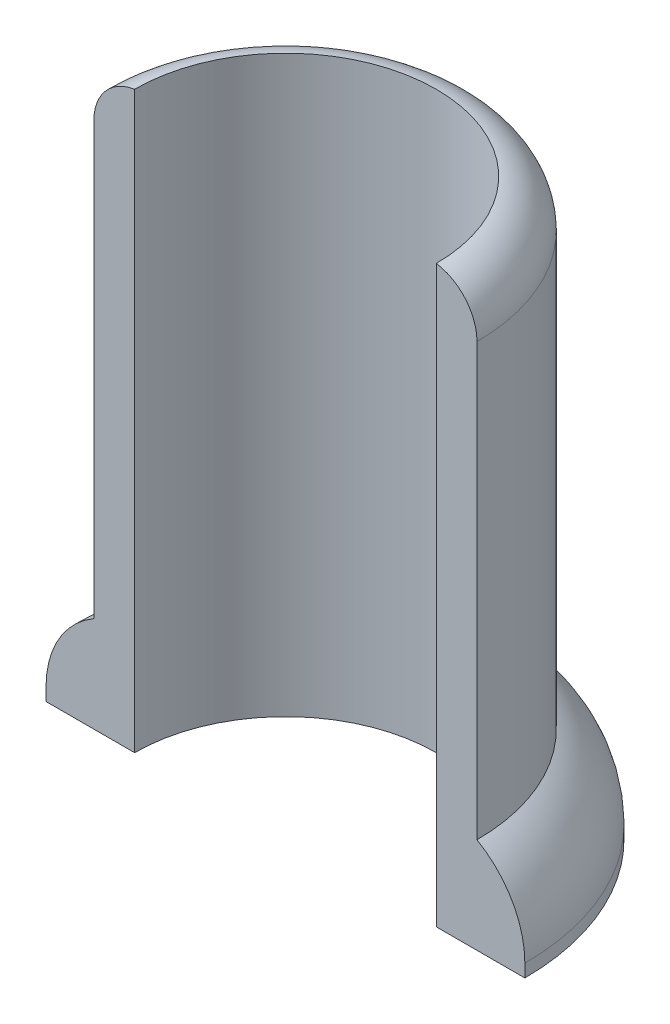
ISO-10303-21;
HEADER;
FILE_DESCRIPTION(('STEP AP214'),'2;1');
FILE_NAME('part.step','',(''),(''),'','','');
FILE_SCHEMA(('AUTOMOTIVE_DESIGN { 1 0 10303 214 1 1 1 1 }'));
ENDSEC;
DATA;
#1=APPLICATION_CONTEXT('core data for automotive mechanical design processes');
#2=APPLICATION_PROTOCOL_DEFINITION('international standard','automotive_design',2000,#1);
#3=PRODUCT_CONTEXT('',#1,'mechanical');
#4=PRODUCT('Part','Part','',(#3));
#5=PRODUCT_RELATED_PRODUCT_CATEGORY('part','',(#4));
#6=PRODUCT_DEFINITION_FORMATION('','',#4);
#7=PRODUCT_DEFINITION_CONTEXT('part definition',#1,'design');
#8=PRODUCT_DEFINITION('design','',#6,#7);
#9=PRODUCT_DEFINITION_SHAPE('','',#8);
#10=(LENGTH_UNIT() NAMED_UNIT(*) SI_UNIT(.MILLI.,.METRE.));
#11=(NAMED_UNIT(*) PLANE_ANGLE_UNIT() SI_UNIT($,.RADIAN.));
#12=(NAMED_UNIT(*) SI_UNIT($,.STERADIAN.) SOLID_ANGLE_UNIT());
#13=UNCERTAINTY_MEASURE_WITH_UNIT(LENGTH_MEASURE(1.E-05),#10,'distance_accuracy_value','');
#14=(GEOMETRIC_REPRESENTATION_CONTEXT(3) GLOBAL_UNCERTAINTY_ASSIGNED_CONTEXT((#13)) GLOBAL_UNIT_ASSIGNED_CONTEXT((#10,
#11,#12)) REPRESENTATION_CONTEXT('',''));
#15=CARTESIAN_POINT('',(0.,0.,0.));
#16=DIRECTION('',(0.,0.,1.));
#17=DIRECTION('',(1.,0.,0.));
#18=AXIS2_PLACEMENT_3D('',#15,#16,#17);
#19=CARTESIAN_POINT('',(5.,10.01,0.));
#20=DIRECTION('',(0.,0.,1.));
#21=DIRECTION('',(1.,0.,0.));
#22=AXIS2_PLACEMENT_3D('',#19,#20,#21);
#23=PLANE('',#22);
#24=CARTESIAN_POINT('',(3.,-1.73205080756888,0.));
#25=DIRECTION('',(0.,0.,1.));
#26=DIRECTION('',(1.,0.,0.));
#27=AXIS2_PLACEMENT_3D('',#24,#25,#26);
#28=CIRCLE('',#27,2.);
#29=CARTESIAN_POINT('',(4.,0.,0.));
#30=VERTEX_POINT('',#29);
#31=CARTESIAN_POINT('',(5.,-1.73205080756888,0.));
#32=VERTEX_POINT('',#31);
#33=EDGE_CURVE('E152',#30,#32,#28,.F.);
#34=ORIENTED_EDGE('',*,*,#33,.F.);
#35=DIRECTION('',(0.,-1.,0.));
#36=VECTOR('',#35,1.);
#37=CARTESIAN_POINT('',(4.,10.,0.));
#38=LINE('',#37,#36);
#39=CARTESIAN_POINT('',(4.,9.01131400333574,0.));
#40=VERTEX_POINT('',#39);
#41=EDGE_CURVE('E158',#30,#40,#38,.F.);
#42=ORIENTED_EDGE('',*,*,#41,.T.);
#43=CARTESIAN_POINT('',(3.,9.01131400333574,0.));
#44=DIRECTION('',(0.,0.,1.));
#45=DIRECTION('',(1.,0.,0.));
#46=AXIS2_PLACEMENT_3D('',#43,#44,#45);
#47=CIRCLE('',#46,1.);
#48=CARTESIAN_POINT('',(3.15000000000001,10.,0.));
#49=VERTEX_POINT('',#48);
#50=EDGE_CURVE('E69',#49,#40,#47,.F.);
#51=ORIENTED_EDGE('',*,*,#50,.F.);
#52=DIRECTION('',(0.,1.,0.));
#53=VECTOR('',#52,1.);
#54=CARTESIAN_POINT('',(3.15,-2.,0.));
#55=LINE('',#54,#53);
#56=CARTESIAN_POINT('',(3.15,-2.,0.));
#57=VERTEX_POINT('',#56);
#58=EDGE_CURVE('E104',#49,#57,#55,.F.);
#59=ORIENTED_EDGE('',*,*,#58,.T.);
#60=DIRECTION('',(-1.,0.,0.));
#61=VECTOR('',#60,1.);
#62=CARTESIAN_POINT('',(0.,-2.,0.));
#63=LINE('',#62,#61);
#64=CARTESIAN_POINT('',(5.,-2.,0.));
#65=VERTEX_POINT('',#64);
#66=EDGE_CURVE('E111',#65,#57,#63,.T.);
#67=ORIENTED_EDGE('',*,*,#66,.F.);
#68=DIRECTION('',(0.,1.,0.));
#69=VECTOR('',#68,1.);
#70=CARTESIAN_POINT('',(5.,-2.,0.));
#71=LINE('',#70,#69);
#72=EDGE_CURVE('E127',#65,#32,#71,.T.);
#73=ORIENTED_EDGE('',*,*,#72,.T.);
#74=EDGE_LOOP('',(#34,#42,#51,#59,#67,#73));
#75=FACE_BOUND('',#74,.T.);
#76=ADVANCED_FACE('F45',(#75),#23,.T.);
#77=CARTESIAN_POINT('',(-3.,-1.73205080756888,0.));
#78=DIRECTION('',(0.,0.,1.));
#79=DIRECTION('',(1.,0.,0.));
#80=AXIS2_PLACEMENT_3D('',#77,#78,#79);
#81=CIRCLE('',#80,2.);
#82=CARTESIAN_POINT('',(-5.,-1.73205080756888,0.));
#83=VERTEX_POINT('',#82);
#84=CARTESIAN_POINT('',(-4.,0.,0.));
#85=VERTEX_POINT('',#84);
#86=EDGE_CURVE('E149',#83,#85,#81,.F.);
#87=ORIENTED_EDGE('',*,*,#86,.F.);
#88=DIRECTION('',(0.,1.,0.));
#89=VECTOR('',#88,1.);
#90=CARTESIAN_POINT('',(-5.,-2.,0.));
#91=LINE('',#90,#89);
#92=CARTESIAN_POINT('',(-5.,-2.,0.));
#93=VERTEX_POINT('',#92);
#94=EDGE_CURVE('E122',#83,#93,#91,.F.);
#95=ORIENTED_EDGE('',*,*,#94,.T.);
#96=CARTESIAN_POINT('',(-3.15,-2.,0.));
#97=VERTEX_POINT('',#96);
#98=EDGE_CURVE('E118',#97,#93,#63,.T.);
#99=ORIENTED_EDGE('',*,*,#98,.F.);
#100=DIRECTION('',(0.,1.,0.));
#101=VECTOR('',#100,1.);
#102=CARTESIAN_POINT('',(-3.15,-2.,0.));
#103=LINE('',#102,#101);
#104=CARTESIAN_POINT('',(-3.15000000000001,10.,0.));
#105=VERTEX_POINT('',#104);
#106=EDGE_CURVE('E105',#97,#105,#103,.T.);
#107=ORIENTED_EDGE('',*,*,#106,.T.);
#108=CARTESIAN_POINT('',(-3.,9.01131400333574,0.));
#109=DIRECTION('',(0.,0.,1.));
#110=DIRECTION('',(1.,0.,0.));
#111=AXIS2_PLACEMENT_3D('',#108,#109,#110);
#112=CIRCLE('',#111,1.);
#113=CARTESIAN_POINT('',(-4.,9.01131400333574,0.));
#114=VERTEX_POINT('',#113);
#115=EDGE_CURVE('E61',#114,#105,#112,.F.);
#116=ORIENTED_EDGE('',*,*,#115,.F.);
#117=DIRECTION('',(0.,-1.,0.));
#118=VECTOR('',#117,1.);
#119=CARTESIAN_POINT('',(-4.,10.,0.));
#120=LINE('',#119,#118);
#121=EDGE_CURVE('E119',#114,#85,#120,.T.);
#122=ORIENTED_EDGE('',*,*,#121,.T.);
#123=EDGE_LOOP('',(#87,#95,#99,#107,#116,#122));
#124=FACE_BOUND('',#123,.T.);
#125=ADVANCED_FACE('F172',(#124),#23,.T.);
#126=CARTESIAN_POINT('',(0.,-2.,0.));
#127=DIRECTION('',(0.,-1.,0.));
#128=DIRECTION('',(0.,0.,-1.));
#129=AXIS2_PLACEMENT_3D('',#126,#127,#128);
#130=PLANE('',#129);
#131=CARTESIAN_POINT('',(0.,-2.,0.));
#132=DIRECTION('',(0.,-1.,0.));
#133=DIRECTION('',(0.,0.,-1.));
#134=AXIS2_PLACEMENT_3D('',#131,#132,#133);
#135=CIRCLE('',#134,5.);
#136=EDGE_CURVE('E109',#93,#65,#135,.T.);
#137=ORIENTED_EDGE('',*,*,#136,.T.);
#138=ORIENTED_EDGE('',*,*,#66,.T.);
#139=CARTESIAN_POINT('',(0.,-2.,0.));
#140=DIRECTION('',(0.,1.,0.));
#141=DIRECTION('',(0.,0.,1.));
#142=AXIS2_PLACEMENT_3D('',#139,#140,#141);
#143=CIRCLE('',#142,3.15);
#144=EDGE_CURVE('E54',#57,#97,#143,.T.);
#145=ORIENTED_EDGE('',*,*,#144,.T.);
#146=ORIENTED_EDGE('',*,*,#98,.T.);
#147=EDGE_LOOP('',(#137,#138,#145,#146));
#148=FACE_BOUND('',#147,.T.);
#149=ADVANCED_FACE('F112',(#148),#130,.T.);
#150=CARTESIAN_POINT('',(0.,-2.,0.));
#151=DIRECTION('',(0.,1.,0.));
#152=DIRECTION('',(0.,0.,1.));
#153=AXIS2_PLACEMENT_3D('',#150,#151,#152);
#154=CYLINDRICAL_SURFACE('',#153,5.);
#155=ORIENTED_EDGE('',*,*,#72,.F.);
#156=ORIENTED_EDGE('',*,*,#136,.F.);
#157=ORIENTED_EDGE('',*,*,#94,.F.);
#158=CARTESIAN_POINT('',(0.,-1.73205080756888,0.));
#159=DIRECTION('',(0.,1.,0.));
#160=DIRECTION('',(0.,0.,1.));
#161=AXIS2_PLACEMENT_3D('',#158,#159,#160);
#162=CIRCLE('',#161,5.);
#163=EDGE_CURVE('E136',#83,#32,#162,.F.);
#164=ORIENTED_EDGE('',*,*,#163,.T.);
#165=EDGE_LOOP('',(#155,#156,#157,#164));
#166=FACE_BOUND('',#165,.T.);
#167=ADVANCED_FACE('F166',(#166),#154,.T.);
#168=CARTESIAN_POINT('',(0.,10.,0.));
#169=DIRECTION('',(0.,-1.,0.));
#170=DIRECTION('',(0.,0.,-1.));
#171=AXIS2_PLACEMENT_3D('',#168,#169,#170);
#172=CYLINDRICAL_SURFACE('',#171,4.);
#173=ORIENTED_EDGE('',*,*,#121,.F.);
#174=CARTESIAN_POINT('',(0.,9.01131400333574,0.));
#175=DIRECTION('',(0.,1.,0.));
#176=DIRECTION('',(0.,0.,1.));
#177=AXIS2_PLACEMENT_3D('',#174,#175,#176);
#178=CIRCLE('',#177,4.);
#179=EDGE_CURVE('E132',#114,#40,#178,.F.);
#180=ORIENTED_EDGE('',*,*,#179,.T.);
#181=ORIENTED_EDGE('',*,*,#41,.F.);
#182=CARTESIAN_POINT('',(0.,0.,0.));
#183=DIRECTION('',(0.,1.,0.));
#184=DIRECTION('',(0.,0.,1.));
#185=AXIS2_PLACEMENT_3D('',#182,#183,#184);
#186=CIRCLE('',#185,4.);
#187=EDGE_CURVE('E140',#30,#85,#186,.T.);
#188=ORIENTED_EDGE('',*,*,#187,.T.);
#189=EDGE_LOOP('',(#173,#180,#181,#188));
#190=FACE_BOUND('',#189,.T.);
#191=ADVANCED_FACE('F171',(#190),#172,.T.);
#192=CARTESIAN_POINT('',(0.,-2.,0.));
#193=DIRECTION('',(0.,1.,0.));
#194=DIRECTION('',(0.,0.,1.));
#195=AXIS2_PLACEMENT_3D('',#192,#193,#194);
#196=CYLINDRICAL_SURFACE('',#195,3.15);
#197=ORIENTED_EDGE('',*,*,#58,.F.);
#198=CARTESIAN_POINT('',(0.,10.,0.));
#199=DIRECTION('',(0.,1.,0.));
#200=DIRECTION('',(0.,0.,1.));
#201=AXIS2_PLACEMENT_3D('',#198,#199,#200);
#202=CIRCLE('',#201,3.15);
#203=EDGE_CURVE('E11',#49,#105,#202,.T.);
#204=ORIENTED_EDGE('',*,*,#203,.T.);
#205=ORIENTED_EDGE('',*,*,#106,.F.);
#206=ORIENTED_EDGE('',*,*,#144,.F.);
#207=EDGE_LOOP('',(#197,#204,#205,#206));
#208=FACE_BOUND('',#207,.T.);
#209=ADVANCED_FACE('F102',(#208),#196,.F.);
#210=CARTESIAN_POINT('',(0.,9.01131400333574,0.));
#211=DIRECTION('',(0.,1.,0.));
#212=DIRECTION('',(0.,0.,1.));
#213=AXIS2_PLACEMENT_3D('',#210,#211,#212);
#214=TOROIDAL_SURFACE('',#213,3.,1.);
#215=ORIENTED_EDGE('',*,*,#203,.F.);
#216=ORIENTED_EDGE('',*,*,#50,.T.);
#217=ORIENTED_EDGE('',*,*,#179,.F.);
#218=ORIENTED_EDGE('',*,*,#115,.T.);
#219=EDGE_LOOP('',(#215,#216,#217,#218));
#220=FACE_BOUND('',#219,.T.);
#221=ADVANCED_FACE('F47',(#220),#214,.T.);
#222=CARTESIAN_POINT('',(0.,-1.73205080756888,0.));
#223=DIRECTION('',(0.,1.,0.));
#224=DIRECTION('',(0.,0.,1.));
#225=AXIS2_PLACEMENT_3D('',#222,#223,#224);
#226=TOROIDAL_SURFACE('',#225,3.,2.);
#227=ORIENTED_EDGE('',*,*,#187,.F.);
#228=ORIENTED_EDGE('',*,*,#33,.T.);
#229=ORIENTED_EDGE('',*,*,#163,.F.);
#230=ORIENTED_EDGE('',*,*,#86,.T.);
#231=EDGE_LOOP('',(#227,#228,#229,#230));
#232=FACE_BOUND('',#231,.T.);
#233=ADVANCED_FACE('F169',(#232),#226,.T.);
#234=CLOSED_SHELL('',(#76,#125,#149,#167,#191,#209,#221,#233));
#235=MANIFOLD_SOLID_BREP('B2',#234);
#236=ADVANCED_BREP_SHAPE_REPRESENTATION('',(#18,#235),#14);
#237=SHAPE_DEFINITION_REPRESENTATION(#9,#236);
ENDSEC;
END-ISO-10303-21;
